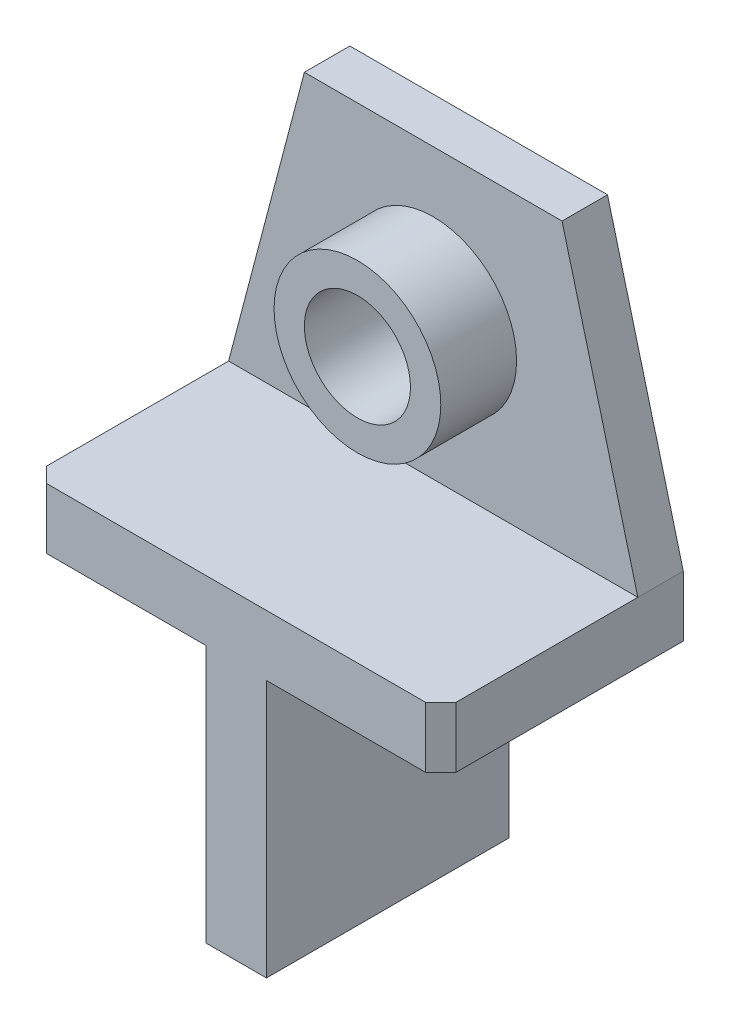
ISO-10303-21;
HEADER;
FILE_DESCRIPTION(('STEP AP214'),'2;1');
FILE_NAME('part.step','',(''),(''),'','','');
FILE_SCHEMA(('AUTOMOTIVE_DESIGN { 1 0 10303 214 1 1 1 1 }'));
ENDSEC;
DATA;
#1=APPLICATION_CONTEXT('core data for automotive mechanical design processes');
#2=APPLICATION_PROTOCOL_DEFINITION('international standard','automotive_design',2000,#1);
#3=PRODUCT_CONTEXT('',#1,'mechanical');
#4=PRODUCT('Part','Part','',(#3));
#5=PRODUCT_RELATED_PRODUCT_CATEGORY('part','',(#4));
#6=PRODUCT_DEFINITION_FORMATION('','',#4);
#7=PRODUCT_DEFINITION_CONTEXT('part definition',#1,'design');
#8=PRODUCT_DEFINITION('design','',#6,#7);
#9=PRODUCT_DEFINITION_SHAPE('','',#8);
#10=(LENGTH_UNIT() NAMED_UNIT(*) SI_UNIT(.MILLI.,.METRE.));
#11=(NAMED_UNIT(*) PLANE_ANGLE_UNIT() SI_UNIT($,.RADIAN.));
#12=(NAMED_UNIT(*) SI_UNIT($,.STERADIAN.) SOLID_ANGLE_UNIT());
#13=UNCERTAINTY_MEASURE_WITH_UNIT(LENGTH_MEASURE(1.E-05),#10,'distance_accuracy_value','');
#14=(GEOMETRIC_REPRESENTATION_CONTEXT(3) GLOBAL_UNCERTAINTY_ASSIGNED_CONTEXT((#13)) GLOBAL_UNIT_ASSIGNED_CONTEXT((#10,
#11,#12)) REPRESENTATION_CONTEXT('',''));
#15=CARTESIAN_POINT('',(0.,0.,0.));
#16=DIRECTION('',(0.,0.,1.));
#17=DIRECTION('',(1.,0.,0.));
#18=AXIS2_PLACEMENT_3D('',#15,#16,#17);
#19=CARTESIAN_POINT('',(-23.,40.2916808844605,-32.));
#20=DIRECTION('',(0.,1.,0.));
#21=DIRECTION('',(-1.,0.,0.));
#22=AXIS2_PLACEMENT_3D('',#19,#20,#21);
#23=PLANE('',#22);
#24=DIRECTION('',(0.,0.,1.));
#25=VECTOR('',#24,1.);
#26=CARTESIAN_POINT('',(31.,40.2916808844605,-32.));
#27=LINE('',#26,#25);
#28=CARTESIAN_POINT('',(31.,40.2916808844605,-26.));
#29=VERTEX_POINT('',#28);
#30=CARTESIAN_POINT('',(31.,40.2916808844605,-2.));
#31=VERTEX_POINT('',#30);
#32=EDGE_CURVE('E145',#29,#31,#27,.T.);
#33=ORIENTED_EDGE('',*,*,#32,.F.);
#34=DIRECTION('',(-1.,0.,0.));
#35=VECTOR('',#34,1.);
#36=CARTESIAN_POINT('',(-23.,40.2916808844605,-26.));
#37=LINE('',#36,#35);
#38=CARTESIAN_POINT('',(-23.,40.2916808844605,-26.));
#39=VERTEX_POINT('',#38);
#40=EDGE_CURVE('E126',#29,#39,#37,.T.);
#41=ORIENTED_EDGE('',*,*,#40,.T.);
#42=DIRECTION('',(0.,0.,1.));
#43=VECTOR('',#42,1.);
#44=CARTESIAN_POINT('',(-23.,40.2916808844605,-32.));
#45=LINE('',#44,#43);
#46=CARTESIAN_POINT('',(-23.,40.2916808844605,-2.));
#47=VERTEX_POINT('',#46);
#48=EDGE_CURVE('E154',#39,#47,#45,.T.);
#49=ORIENTED_EDGE('',*,*,#48,.T.);
#50=DIRECTION('',(0.707106781186548,0.,0.707106781186548));
#51=VECTOR('',#50,1.);
#52=CARTESIAN_POINT('',(-38.,40.2916808844605,-17.));
#53=LINE('',#52,#51);
#54=CARTESIAN_POINT('',(-21.,40.2916808844605,0.));
#55=VERTEX_POINT('',#54);
#56=EDGE_CURVE('E178',#47,#55,#53,.T.);
#57=ORIENTED_EDGE('',*,*,#56,.T.);
#58=DIRECTION('',(-1.,0.,0.));
#59=VECTOR('',#58,1.);
#60=CARTESIAN_POINT('',(-23.,40.2916808844605,0.));
#61=LINE('',#60,#59);
#62=CARTESIAN_POINT('',(29.,40.2916808844605,0.));
#63=VERTEX_POINT('',#62);
#64=EDGE_CURVE('E181',#63,#55,#61,.T.);
#65=ORIENTED_EDGE('',*,*,#64,.F.);
#66=DIRECTION('',(0.707106781186548,0.,-0.707106781186547));
#67=VECTOR('',#66,1.);
#68=CARTESIAN_POINT('',(19.,40.2916808844605,10.));
#69=LINE('',#68,#67);
#70=EDGE_CURVE('E147',#63,#31,#69,.T.);
#71=ORIENTED_EDGE('',*,*,#70,.T.);
#72=EDGE_LOOP('',(#33,#41,#49,#57,#65,#71));
#73=FACE_BOUND('',#72,.T.);
#74=ADVANCED_FACE('F33',(#73),#23,.T.);
#75=CARTESIAN_POINT('',(8.,-1.70831911553948,-32.));
#76=DIRECTION('',(0.,-1.,0.));
#77=DIRECTION('',(0.,0.,-1.));
#78=AXIS2_PLACEMENT_3D('',#75,#76,#77);
#79=PLANE('',#78);
#80=DIRECTION('',(1.,0.,0.));
#81=VECTOR('',#80,1.);
#82=CARTESIAN_POINT('',(8.,-1.70831911553948,0.));
#83=LINE('',#82,#81);
#84=CARTESIAN_POINT('',(0.,-1.70831911553948,0.));
#85=VERTEX_POINT('',#84);
#86=CARTESIAN_POINT('',(8.,-1.70831911553948,0.));
#87=VERTEX_POINT('',#86);
#88=EDGE_CURVE('E220',#85,#87,#83,.T.);
#89=ORIENTED_EDGE('',*,*,#88,.F.);
#90=DIRECTION('',(0.,0.,1.));
#91=VECTOR('',#90,1.);
#92=CARTESIAN_POINT('',(0.,-1.70831911553948,-32.));
#93=LINE('',#92,#91);
#94=CARTESIAN_POINT('',(0.,-1.70831911553948,-32.));
#95=VERTEX_POINT('',#94);
#96=EDGE_CURVE('E169',#95,#85,#93,.T.);
#97=ORIENTED_EDGE('',*,*,#96,.F.);
#98=DIRECTION('',(1.,0.,0.));
#99=VECTOR('',#98,1.);
#100=CARTESIAN_POINT('',(8.,-1.70831911553948,-32.));
#101=LINE('',#100,#99);
#102=CARTESIAN_POINT('',(8.,-1.70831911553948,-32.));
#103=VERTEX_POINT('',#102);
#104=EDGE_CURVE('E214',#95,#103,#101,.T.);
#105=ORIENTED_EDGE('',*,*,#104,.T.);
#106=DIRECTION('',(0.,0.,1.));
#107=VECTOR('',#106,1.);
#108=CARTESIAN_POINT('',(8.,-1.70831911553948,-32.));
#109=LINE('',#108,#107);
#110=EDGE_CURVE('E162',#103,#87,#109,.T.);
#111=ORIENTED_EDGE('',*,*,#110,.T.);
#112=EDGE_LOOP('',(#89,#97,#105,#111));
#113=FACE_BOUND('',#112,.T.);
#114=ADVANCED_FACE('F279',(#113),#79,.T.);
#115=CARTESIAN_POINT('',(0.,-1.70831911553948,-32.));
#116=DIRECTION('',(-1.,0.,0.));
#117=DIRECTION('',(0.,0.,1.));
#118=AXIS2_PLACEMENT_3D('',#115,#116,#117);
#119=PLANE('',#118);
#120=DIRECTION('',(0.,-1.,0.));
#121=VECTOR('',#120,1.);
#122=CARTESIAN_POINT('',(0.,-1.70831911553948,0.));
#123=LINE('',#122,#121);
#124=CARTESIAN_POINT('',(0.,32.2916808844605,0.));
#125=VERTEX_POINT('',#124);
#126=EDGE_CURVE('E211',#125,#85,#123,.T.);
#127=ORIENTED_EDGE('',*,*,#126,.F.);
#128=DIRECTION('',(0.,0.,1.));
#129=VECTOR('',#128,1.);
#130=CARTESIAN_POINT('',(0.,32.2916808844605,-32.));
#131=LINE('',#130,#129);
#132=CARTESIAN_POINT('',(0.,32.2916808844605,-32.));
#133=VERTEX_POINT('',#132);
#134=EDGE_CURVE('E207',#133,#125,#131,.T.);
#135=ORIENTED_EDGE('',*,*,#134,.F.);
#136=DIRECTION('',(0.,-1.,0.));
#137=VECTOR('',#136,1.);
#138=CARTESIAN_POINT('',(0.,-1.70831911553948,-32.));
#139=LINE('',#138,#137);
#140=EDGE_CURVE('E164',#133,#95,#139,.T.);
#141=ORIENTED_EDGE('',*,*,#140,.T.);
#142=ORIENTED_EDGE('',*,*,#96,.T.);
#143=EDGE_LOOP('',(#127,#135,#141,#142));
#144=FACE_BOUND('',#143,.T.);
#145=ADVANCED_FACE('F284',(#144),#119,.T.);
#146=CARTESIAN_POINT('',(0.,32.2916808844605,-32.));
#147=DIRECTION('',(0.,-1.,0.));
#148=DIRECTION('',(0.,0.,-1.));
#149=AXIS2_PLACEMENT_3D('',#146,#147,#148);
#150=PLANE('',#149);
#151=DIRECTION('',(1.,0.,0.));
#152=VECTOR('',#151,1.);
#153=CARTESIAN_POINT('',(0.,32.2916808844605,0.));
#154=LINE('',#153,#152);
#155=CARTESIAN_POINT('',(-21.,32.2916808844605,0.));
#156=VERTEX_POINT('',#155);
#157=EDGE_CURVE('E190',#156,#125,#154,.T.);
#158=ORIENTED_EDGE('',*,*,#157,.F.);
#159=DIRECTION('',(-0.707106781186548,0.,-0.707106781186548));
#160=VECTOR('',#159,1.);
#161=CARTESIAN_POINT('',(-26.5,32.2916808844605,-5.49999999999999));
#162=LINE('',#161,#160);
#163=CARTESIAN_POINT('',(-23.,32.2916808844605,-2.));
#164=VERTEX_POINT('',#163);
#165=EDGE_CURVE('E172',#156,#164,#162,.T.);
#166=ORIENTED_EDGE('',*,*,#165,.T.);
#167=DIRECTION('',(0.,0.,1.));
#168=VECTOR('',#167,1.);
#169=CARTESIAN_POINT('',(-23.,32.2916808844605,-32.));
#170=LINE('',#169,#168);
#171=CARTESIAN_POINT('',(-23.,32.2916808844605,-32.));
#172=VERTEX_POINT('',#171);
#173=EDGE_CURVE('E198',#172,#164,#170,.T.);
#174=ORIENTED_EDGE('',*,*,#173,.F.);
#175=DIRECTION('',(1.,0.,0.));
#176=VECTOR('',#175,1.);
#177=CARTESIAN_POINT('',(0.,32.2916808844605,-32.));
#178=LINE('',#177,#176);
#179=EDGE_CURVE('E225',#172,#133,#178,.T.);
#180=ORIENTED_EDGE('',*,*,#179,.T.);
#181=ORIENTED_EDGE('',*,*,#134,.T.);
#182=EDGE_LOOP('',(#158,#166,#174,#180,#181));
#183=FACE_BOUND('',#182,.T.);
#184=ADVANCED_FACE('F196',(#183),#150,.T.);
#185=CARTESIAN_POINT('',(-23.,32.2916808844605,-32.));
#186=DIRECTION('',(-1.,0.,0.));
#187=DIRECTION('',(0.,0.,1.));
#188=AXIS2_PLACEMENT_3D('',#185,#186,#187);
#189=PLANE('',#188);
#190=ORIENTED_EDGE('',*,*,#173,.T.);
#191=DIRECTION('',(0.,1.,0.));
#192=VECTOR('',#191,1.);
#193=CARTESIAN_POINT('',(-23.,40.2916808844605,-2.));
#194=LINE('',#193,#192);
#195=EDGE_CURVE('E174',#164,#47,#194,.T.);
#196=ORIENTED_EDGE('',*,*,#195,.T.);
#197=ORIENTED_EDGE('',*,*,#48,.F.);
#198=CARTESIAN_POINT('',(-23.,40.2916808844605,-32.));
#199=VERTEX_POINT('',#198);
#200=EDGE_CURVE('E155',#199,#39,#45,.T.);
#201=ORIENTED_EDGE('',*,*,#200,.F.);
#202=DIRECTION('',(0.,-1.,0.));
#203=VECTOR('',#202,1.);
#204=CARTESIAN_POINT('',(-23.,32.2916808844605,-32.));
#205=LINE('',#204,#203);
#206=EDGE_CURVE('E206',#199,#172,#205,.T.);
#207=ORIENTED_EDGE('',*,*,#206,.T.);
#208=EDGE_LOOP('',(#190,#196,#197,#201,#207));
#209=FACE_BOUND('',#208,.T.);
#210=ADVANCED_FACE('F203',(#209),#189,.T.);
#211=CARTESIAN_POINT('',(31.,40.2916808844605,-32.));
#212=DIRECTION('',(1.,0.,0.));
#213=DIRECTION('',(0.,1.,0.));
#214=AXIS2_PLACEMENT_3D('',#211,#212,#213);
#215=PLANE('',#214);
#216=CARTESIAN_POINT('',(31.,40.2916808844605,-32.));
#217=VERTEX_POINT('',#216);
#218=EDGE_CURVE('E139',#217,#29,#27,.T.);
#219=ORIENTED_EDGE('',*,*,#218,.T.);
#220=ORIENTED_EDGE('',*,*,#32,.T.);
#221=DIRECTION('',(0.,-1.,0.));
#222=VECTOR('',#221,1.);
#223=CARTESIAN_POINT('',(31.,32.2916808844605,-2.));
#224=LINE('',#223,#222);
#225=CARTESIAN_POINT('',(31.,32.2916808844605,-2.));
#226=VERTEX_POINT('',#225);
#227=EDGE_CURVE('E41',#31,#226,#224,.T.);
#228=ORIENTED_EDGE('',*,*,#227,.T.);
#229=DIRECTION('',(0.,0.,1.));
#230=VECTOR('',#229,1.);
#231=CARTESIAN_POINT('',(31.,32.2916808844605,-32.));
#232=LINE('',#231,#230);
#233=CARTESIAN_POINT('',(31.,32.2916808844605,-32.));
#234=VERTEX_POINT('',#233);
#235=EDGE_CURVE('E148',#234,#226,#232,.T.);
#236=ORIENTED_EDGE('',*,*,#235,.F.);
#237=DIRECTION('',(0.,1.,0.));
#238=VECTOR('',#237,1.);
#239=CARTESIAN_POINT('',(31.,40.2916808844605,-32.));
#240=LINE('',#239,#238);
#241=EDGE_CURVE('E153',#234,#217,#240,.T.);
#242=ORIENTED_EDGE('',*,*,#241,.T.);
#243=EDGE_LOOP('',(#219,#220,#228,#236,#242));
#244=FACE_BOUND('',#243,.T.);
#245=ADVANCED_FACE('F151',(#244),#215,.T.);
#246=CARTESIAN_POINT('',(31.,32.2916808844605,-32.));
#247=DIRECTION('',(0.,-1.,0.));
#248=DIRECTION('',(1.,0.,0.));
#249=AXIS2_PLACEMENT_3D('',#246,#247,#248);
#250=PLANE('',#249);
#251=ORIENTED_EDGE('',*,*,#235,.T.);
#252=DIRECTION('',(-0.707106781186548,0.,0.707106781186547));
#253=VECTOR('',#252,1.);
#254=CARTESIAN_POINT('',(46.,32.2916808844605,-17.));
#255=LINE('',#254,#253);
#256=CARTESIAN_POINT('',(29.,32.2916808844605,0.));
#257=VERTEX_POINT('',#256);
#258=EDGE_CURVE('E11',#226,#257,#255,.T.);
#259=ORIENTED_EDGE('',*,*,#258,.T.);
#260=DIRECTION('',(1.,0.,0.));
#261=VECTOR('',#260,1.);
#262=CARTESIAN_POINT('',(31.,32.2916808844605,0.));
#263=LINE('',#262,#261);
#264=CARTESIAN_POINT('',(8.,32.2916808844605,0.));
#265=VERTEX_POINT('',#264);
#266=EDGE_CURVE('E191',#265,#257,#263,.T.);
#267=ORIENTED_EDGE('',*,*,#266,.F.);
#268=DIRECTION('',(0.,0.,1.));
#269=VECTOR('',#268,1.);
#270=CARTESIAN_POINT('',(8.,32.2916808844605,-32.));
#271=LINE('',#270,#269);
#272=CARTESIAN_POINT('',(8.,32.2916808844605,-32.));
#273=VERTEX_POINT('',#272);
#274=EDGE_CURVE('E160',#273,#265,#271,.T.);
#275=ORIENTED_EDGE('',*,*,#274,.F.);
#276=DIRECTION('',(1.,0.,0.));
#277=VECTOR('',#276,1.);
#278=CARTESIAN_POINT('',(31.,32.2916808844605,-32.));
#279=LINE('',#278,#277);
#280=EDGE_CURVE('E229',#273,#234,#279,.T.);
#281=ORIENTED_EDGE('',*,*,#280,.T.);
#282=EDGE_LOOP('',(#251,#259,#267,#275,#281));
#283=FACE_BOUND('',#282,.T.);
#284=ADVANCED_FACE('F292',(#283),#250,.T.);
#285=CARTESIAN_POINT('',(8.,32.2916808844605,-32.));
#286=DIRECTION('',(1.,0.,0.));
#287=DIRECTION('',(0.,1.,0.));
#288=AXIS2_PLACEMENT_3D('',#285,#286,#287);
#289=PLANE('',#288);
#290=DIRECTION('',(0.,1.,0.));
#291=VECTOR('',#290,1.);
#292=CARTESIAN_POINT('',(8.,32.2916808844605,0.));
#293=LINE('',#292,#291);
#294=EDGE_CURVE('E217',#87,#265,#293,.T.);
#295=ORIENTED_EDGE('',*,*,#294,.F.);
#296=ORIENTED_EDGE('',*,*,#110,.F.);
#297=DIRECTION('',(0.,1.,0.));
#298=VECTOR('',#297,1.);
#299=CARTESIAN_POINT('',(8.,32.2916808844605,-32.));
#300=LINE('',#299,#298);
#301=EDGE_CURVE('E232',#103,#273,#300,.T.);
#302=ORIENTED_EDGE('',*,*,#301,.T.);
#303=ORIENTED_EDGE('',*,*,#274,.T.);
#304=EDGE_LOOP('',(#295,#296,#302,#303));
#305=FACE_BOUND('',#304,.T.);
#306=ADVANCED_FACE('F295',(#305),#289,.T.);
#307=CARTESIAN_POINT('',(0.,0.,-32.));
#308=DIRECTION('',(0.,0.,-1.));
#309=DIRECTION('',(-1.,0.,0.));
#310=AXIS2_PLACEMENT_3D('',#307,#308,#309);
#311=PLANE('',#310);
#312=CARTESIAN_POINT('',(3.99999999999999,59.2916808844605,-32.));
#313=DIRECTION('',(0.,0.,1.));
#314=DIRECTION('',(1.,0.,0.));
#315=AXIS2_PLACEMENT_3D('',#312,#313,#314);
#316=CIRCLE('',#315,7.);
#317=CARTESIAN_POINT('',(11.,59.2916808844605,-32.));
#318=VERTEX_POINT('',#317);
#319=EDGE_CURVE('E259',#318,#318,#316,.T.);
#320=ORIENTED_EDGE('',*,*,#319,.T.);
#321=EDGE_LOOP('',(#320));
#322=FACE_BOUND('',#321,.T.);
#323=ORIENTED_EDGE('',*,*,#104,.F.);
#324=ORIENTED_EDGE('',*,*,#140,.F.);
#325=ORIENTED_EDGE('',*,*,#179,.F.);
#326=ORIENTED_EDGE('',*,*,#206,.F.);
#327=DIRECTION('',(0.254493299279644,0.967074537262646,0.));
#328=VECTOR('',#327,1.);
#329=CARTESIAN_POINT('',(-13.,78.2916808844605,-32.));
#330=LINE('',#329,#328);
#331=CARTESIAN_POINT('',(-13.,78.2916808844605,-32.));
#332=VERTEX_POINT('',#331);
#333=EDGE_CURVE('E243',#199,#332,#330,.T.);
#334=ORIENTED_EDGE('',*,*,#333,.T.);
#335=DIRECTION('',(1.,0.,0.));
#336=VECTOR('',#335,1.);
#337=CARTESIAN_POINT('',(-13.,78.2916808844605,-32.));
#338=LINE('',#337,#336);
#339=CARTESIAN_POINT('',(21.,78.2916808844605,-32.));
#340=VERTEX_POINT('',#339);
#341=EDGE_CURVE('E142',#332,#340,#338,.T.);
#342=ORIENTED_EDGE('',*,*,#341,.T.);
#343=DIRECTION('',(0.254493299279644,-0.967074537262646,0.));
#344=VECTOR('',#343,1.);
#345=CARTESIAN_POINT('',(21.,78.2916808844605,-32.));
#346=LINE('',#345,#344);
#347=EDGE_CURVE('E246',#340,#217,#346,.T.);
#348=ORIENTED_EDGE('',*,*,#347,.T.);
#349=ORIENTED_EDGE('',*,*,#241,.F.);
#350=ORIENTED_EDGE('',*,*,#280,.F.);
#351=ORIENTED_EDGE('',*,*,#301,.F.);
#352=EDGE_LOOP('',(#323,#324,#325,#326,#334,#342,#348,#349,#350,#351));
#353=FACE_BOUND('',#352,.T.);
#354=ADVANCED_FACE('F263',(#322,#353),#311,.T.);
#355=CARTESIAN_POINT('',(0.,0.,0.));
#356=DIRECTION('',(0.,0.,-1.));
#357=DIRECTION('',(-1.,0.,0.));
#358=AXIS2_PLACEMENT_3D('',#355,#356,#357);
#359=PLANE('',#358);
#360=ORIENTED_EDGE('',*,*,#64,.T.);
#361=DIRECTION('',(0.,-1.,0.));
#362=VECTOR('',#361,1.);
#363=CARTESIAN_POINT('',(-21.,32.2916808844605,0.));
#364=LINE('',#363,#362);
#365=EDGE_CURVE('E168',#55,#156,#364,.T.);
#366=ORIENTED_EDGE('',*,*,#365,.T.);
#367=ORIENTED_EDGE('',*,*,#157,.T.);
#368=ORIENTED_EDGE('',*,*,#126,.T.);
#369=ORIENTED_EDGE('',*,*,#88,.T.);
#370=ORIENTED_EDGE('',*,*,#294,.T.);
#371=ORIENTED_EDGE('',*,*,#266,.T.);
#372=DIRECTION('',(0.,1.,0.));
#373=VECTOR('',#372,1.);
#374=CARTESIAN_POINT('',(29.,40.2916808844605,0.));
#375=LINE('',#374,#373);
#376=EDGE_CURVE('E165',#257,#63,#375,.T.);
#377=ORIENTED_EDGE('',*,*,#376,.T.);
#378=EDGE_LOOP('',(#360,#366,#367,#368,#369,#370,#371,#377));
#379=FACE_BOUND('',#378,.T.);
#380=ADVANCED_FACE('F186',(#379),#359,.F.);
#381=CARTESIAN_POINT('',(-21.,0.,0.));
#382=DIRECTION('',(-0.707106781186547,0.,0.707106781186547));
#383=DIRECTION('',(0.,1.,0.));
#384=AXIS2_PLACEMENT_3D('',#381,#382,#383);
#385=PLANE('',#384);
#386=ORIENTED_EDGE('',*,*,#56,.F.);
#387=ORIENTED_EDGE('',*,*,#195,.F.);
#388=ORIENTED_EDGE('',*,*,#165,.F.);
#389=ORIENTED_EDGE('',*,*,#365,.F.);
#390=EDGE_LOOP('',(#386,#387,#388,#389));
#391=FACE_BOUND('',#390,.T.);
#392=ADVANCED_FACE('F193',(#391),#385,.T.);
#393=CARTESIAN_POINT('',(29.,0.,0.));
#394=DIRECTION('',(0.707106781186547,0.,0.707106781186548));
#395=DIRECTION('',(0.,-1.,0.));
#396=AXIS2_PLACEMENT_3D('',#393,#394,#395);
#397=PLANE('',#396);
#398=ORIENTED_EDGE('',*,*,#258,.F.);
#399=ORIENTED_EDGE('',*,*,#227,.F.);
#400=ORIENTED_EDGE('',*,*,#70,.F.);
#401=ORIENTED_EDGE('',*,*,#376,.F.);
#402=EDGE_LOOP('',(#398,#399,#400,#401));
#403=FACE_BOUND('',#402,.T.);
#404=ADVANCED_FACE('F35',(#403),#397,.T.);
#405=CARTESIAN_POINT('',(21.,78.2916808844605,-26.));
#406=DIRECTION('',(0.967074537262646,0.254493299279644,0.));
#407=DIRECTION('',(-0.254493299279644,0.967074537262646,0.));
#408=AXIS2_PLACEMENT_3D('',#405,#406,#407);
#409=PLANE('',#408);
#410=ORIENTED_EDGE('',*,*,#347,.F.);
#411=DIRECTION('',(0.,0.,-1.));
#412=VECTOR('',#411,1.);
#413=CARTESIAN_POINT('',(21.,78.2916808844605,-26.));
#414=LINE('',#413,#412);
#415=CARTESIAN_POINT('',(21.,78.2916808844605,-26.));
#416=VERTEX_POINT('',#415);
#417=EDGE_CURVE('E141',#416,#340,#414,.T.);
#418=ORIENTED_EDGE('',*,*,#417,.F.);
#419=DIRECTION('',(0.254493299279644,-0.967074537262646,0.));
#420=VECTOR('',#419,1.);
#421=CARTESIAN_POINT('',(21.,78.2916808844605,-26.));
#422=LINE('',#421,#420);
#423=EDGE_CURVE('E129',#416,#29,#422,.T.);
#424=ORIENTED_EDGE('',*,*,#423,.T.);
#425=ORIENTED_EDGE('',*,*,#218,.F.);
#426=EDGE_LOOP('',(#410,#418,#424,#425));
#427=FACE_BOUND('',#426,.T.);
#428=ADVANCED_FACE('F137',(#427),#409,.T.);
#429=CARTESIAN_POINT('',(-13.,78.2916808844605,-26.));
#430=DIRECTION('',(0.,1.,0.));
#431=DIRECTION('',(-1.,0.,0.));
#432=AXIS2_PLACEMENT_3D('',#429,#430,#431);
#433=PLANE('',#432);
#434=ORIENTED_EDGE('',*,*,#341,.F.);
#435=DIRECTION('',(0.,0.,-1.));
#436=VECTOR('',#435,1.);
#437=CARTESIAN_POINT('',(-13.,78.2916808844605,-26.));
#438=LINE('',#437,#436);
#439=CARTESIAN_POINT('',(-13.,78.2916808844605,-26.));
#440=VERTEX_POINT('',#439);
#441=EDGE_CURVE('E237',#440,#332,#438,.T.);
#442=ORIENTED_EDGE('',*,*,#441,.F.);
#443=DIRECTION('',(1.,0.,0.));
#444=VECTOR('',#443,1.);
#445=CARTESIAN_POINT('',(-13.,78.2916808844605,-26.));
#446=LINE('',#445,#444);
#447=EDGE_CURVE('E239',#440,#416,#446,.T.);
#448=ORIENTED_EDGE('',*,*,#447,.T.);
#449=ORIENTED_EDGE('',*,*,#417,.T.);
#450=EDGE_LOOP('',(#434,#442,#448,#449));
#451=FACE_BOUND('',#450,.T.);
#452=ADVANCED_FACE('F379',(#451),#433,.T.);
#453=CARTESIAN_POINT('',(-13.,78.2916808844605,-26.));
#454=DIRECTION('',(-0.967074537262646,0.254493299279644,0.));
#455=DIRECTION('',(-0.254493299279644,-0.967074537262646,0.));
#456=AXIS2_PLACEMENT_3D('',#453,#454,#455);
#457=PLANE('',#456);
#458=ORIENTED_EDGE('',*,*,#333,.F.);
#459=ORIENTED_EDGE('',*,*,#200,.T.);
#460=DIRECTION('',(0.254493299279644,0.967074537262646,0.));
#461=VECTOR('',#460,1.);
#462=CARTESIAN_POINT('',(-13.,78.2916808844605,-26.));
#463=LINE('',#462,#461);
#464=EDGE_CURVE('E48',#39,#440,#463,.T.);
#465=ORIENTED_EDGE('',*,*,#464,.T.);
#466=ORIENTED_EDGE('',*,*,#441,.T.);
#467=EDGE_LOOP('',(#458,#459,#465,#466));
#468=FACE_BOUND('',#467,.T.);
#469=ADVANCED_FACE('F370',(#468),#457,.T.);
#470=CARTESIAN_POINT('',(0.,0.,-26.));
#471=DIRECTION('',(0.,0.,1.));
#472=DIRECTION('',(1.,0.,0.));
#473=AXIS2_PLACEMENT_3D('',#470,#471,#472);
#474=PLANE('',#473);
#475=CARTESIAN_POINT('',(3.99999999999999,59.2916808844605,-26.));
#476=DIRECTION('',(0.,0.,1.));
#477=DIRECTION('',(1.,0.,0.));
#478=AXIS2_PLACEMENT_3D('',#475,#476,#477);
#479=CIRCLE('',#478,11.);
#480=CARTESIAN_POINT('',(15.,59.2916808844605,-26.));
#481=VERTEX_POINT('',#480);
#482=EDGE_CURVE('E251',#481,#481,#479,.T.);
#483=ORIENTED_EDGE('',*,*,#482,.F.);
#484=EDGE_LOOP('',(#483));
#485=FACE_BOUND('',#484,.T.);
#486=ORIENTED_EDGE('',*,*,#423,.F.);
#487=ORIENTED_EDGE('',*,*,#447,.F.);
#488=ORIENTED_EDGE('',*,*,#464,.F.);
#489=ORIENTED_EDGE('',*,*,#40,.F.);
#490=EDGE_LOOP('',(#486,#487,#488,#489));
#491=FACE_BOUND('',#490,.T.);
#492=ADVANCED_FACE('F128',(#485,#491),#474,.T.);
#493=CARTESIAN_POINT('',(3.99999999999999,59.2916808844605,-16.));
#494=DIRECTION('',(0.,0.,1.));
#495=DIRECTION('',(1.,0.,0.));
#496=AXIS2_PLACEMENT_3D('',#493,#494,#495);
#497=PLANE('',#496);
#498=CARTESIAN_POINT('',(3.99999999999999,59.2916808844605,-16.));
#499=DIRECTION('',(0.,0.,1.));
#500=DIRECTION('',(1.,0.,0.));
#501=AXIS2_PLACEMENT_3D('',#498,#499,#500);
#502=CIRCLE('',#501,11.);
#503=CARTESIAN_POINT('',(15.,59.2916808844605,-16.));
#504=VERTEX_POINT('',#503);
#505=EDGE_CURVE('E248',#504,#504,#502,.T.);
#506=ORIENTED_EDGE('',*,*,#505,.T.);
#507=EDGE_LOOP('',(#506));
#508=FACE_BOUND('',#507,.T.);
#509=CARTESIAN_POINT('',(3.99999999999999,59.2916808844605,-16.));
#510=DIRECTION('',(0.,0.,1.));
#511=DIRECTION('',(1.,0.,0.));
#512=AXIS2_PLACEMENT_3D('',#509,#510,#511);
#513=CIRCLE('',#512,7.);
#514=CARTESIAN_POINT('',(11.,59.2916808844605,-16.));
#515=VERTEX_POINT('',#514);
#516=EDGE_CURVE('E254',#515,#515,#513,.T.);
#517=ORIENTED_EDGE('',*,*,#516,.F.);
#518=EDGE_LOOP('',(#517));
#519=FACE_BOUND('',#518,.T.);
#520=ADVANCED_FACE('F274',(#508,#519),#497,.T.);
#521=CARTESIAN_POINT('',(3.99999999999999,59.2916808844605,-16.));
#522=DIRECTION('',(0.,0.,-1.));
#523=DIRECTION('',(-1.,0.,0.));
#524=AXIS2_PLACEMENT_3D('',#521,#522,#523);
#525=CYLINDRICAL_SURFACE('',#524,11.);
#526=ORIENTED_EDGE('',*,*,#505,.F.);
#527=EDGE_LOOP('',(#526));
#528=FACE_BOUND('',#527,.T.);
#529=ORIENTED_EDGE('',*,*,#482,.T.);
#530=EDGE_LOOP('',(#529));
#531=FACE_BOUND('',#530,.T.);
#532=ADVANCED_FACE('F268',(#528,#531),#525,.T.);
#533=CARTESIAN_POINT('',(3.99999999999999,59.2916808844605,-16.));
#534=DIRECTION('',(0.,0.,-1.));
#535=DIRECTION('',(-1.,0.,0.));
#536=AXIS2_PLACEMENT_3D('',#533,#534,#535);
#537=CYLINDRICAL_SURFACE('',#536,7.);
#538=ORIENTED_EDGE('',*,*,#516,.T.);
#539=EDGE_LOOP('',(#538));
#540=FACE_BOUND('',#539,.T.);
#541=ORIENTED_EDGE('',*,*,#319,.F.);
#542=EDGE_LOOP('',(#541));
#543=FACE_BOUND('',#542,.T.);
#544=ADVANCED_FACE('F266',(#540,#543),#537,.F.);
#545=CLOSED_SHELL('',(#74,#114,#145,#184,#210,#245,#284,#306,#354,#380,#392,#404,#428,#452,#469,
#492,#520,#532,#544));
#546=MANIFOLD_SOLID_BREP('B2',#545);
#547=ADVANCED_BREP_SHAPE_REPRESENTATION('',(#18,#546),#14);
#548=SHAPE_DEFINITION_REPRESENTATION(#9,#547);
ENDSEC;
END-ISO-10303-21;
